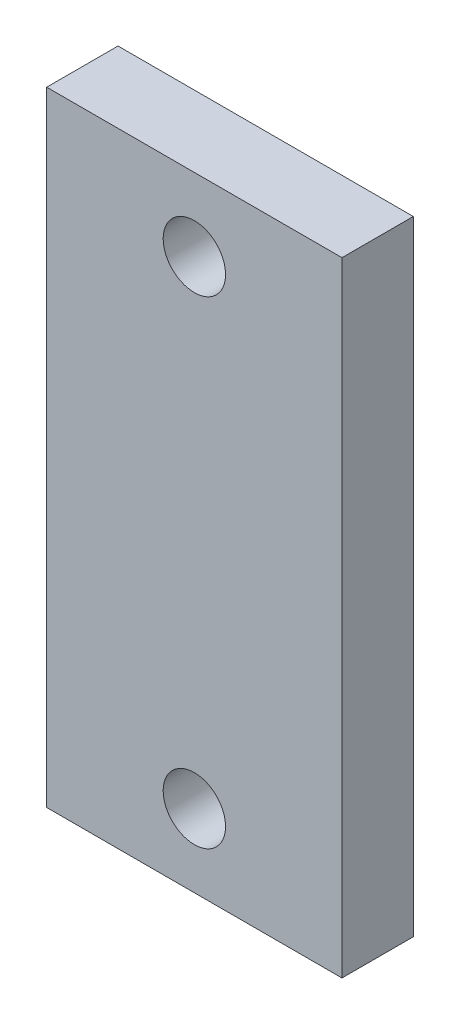
ISO-10303-21;
HEADER;
FILE_DESCRIPTION(('STEP AP214'),'2;1');
FILE_NAME('part.step','',(''),(''),'','','');
FILE_SCHEMA(('AUTOMOTIVE_DESIGN { 1 0 10303 214 1 1 1 1 }'));
ENDSEC;
DATA;
#1=APPLICATION_CONTEXT('core data for automotive mechanical design processes');
#2=APPLICATION_PROTOCOL_DEFINITION('international standard','automotive_design',2000,#1);
#3=PRODUCT_CONTEXT('',#1,'mechanical');
#4=PRODUCT('Part','Part','',(#3));
#5=PRODUCT_RELATED_PRODUCT_CATEGORY('part','',(#4));
#6=PRODUCT_DEFINITION_FORMATION('','',#4);
#7=PRODUCT_DEFINITION_CONTEXT('part definition',#1,'design');
#8=PRODUCT_DEFINITION('design','',#6,#7);
#9=PRODUCT_DEFINITION_SHAPE('','',#8);
#10=(LENGTH_UNIT() NAMED_UNIT(*) SI_UNIT(.MILLI.,.METRE.));
#11=(NAMED_UNIT(*) PLANE_ANGLE_UNIT() SI_UNIT($,.RADIAN.));
#12=(NAMED_UNIT(*) SI_UNIT($,.STERADIAN.) SOLID_ANGLE_UNIT());
#13=UNCERTAINTY_MEASURE_WITH_UNIT(LENGTH_MEASURE(1.E-05),#10,'distance_accuracy_value','');
#14=(GEOMETRIC_REPRESENTATION_CONTEXT(3) GLOBAL_UNCERTAINTY_ASSIGNED_CONTEXT((#13)) GLOBAL_UNIT_ASSIGNED_CONTEXT((#10,
#11,#12)) REPRESENTATION_CONTEXT('',''));
#15=CARTESIAN_POINT('',(0.,0.,0.));
#16=DIRECTION('',(0.,0.,1.));
#17=DIRECTION('',(1.,0.,0.));
#18=AXIS2_PLACEMENT_3D('',#15,#16,#17);
#19=CARTESIAN_POINT('',(0.,0.,3.43));
#20=DIRECTION('',(0.,0.,1.));
#21=DIRECTION('',(1.,0.,0.));
#22=AXIS2_PLACEMENT_3D('',#19,#20,#21);
#23=PLANE('',#22);
#24=CARTESIAN_POINT('',(96.833621,-136.643646,3.43));
#25=DIRECTION('',(0.,0.,1.));
#26=DIRECTION('',(1.,0.,0.));
#27=AXIS2_PLACEMENT_3D('',#24,#25,#26);
#28=CIRCLE('',#27,1.5);
#29=CARTESIAN_POINT('',(95.333621,-136.643646,3.43));
#30=VERTEX_POINT('',#29);
#31=EDGE_CURVE('E97',#30,#30,#28,.T.);
#32=ORIENTED_EDGE('',*,*,#31,.F.);
#33=EDGE_LOOP('',(#32));
#34=FACE_BOUND('',#33,.T.);
#35=DIRECTION('',(0.,-1.,0.));
#36=VECTOR('',#35,1.);
#37=CARTESIAN_POINT('',(89.732371,-110.148646,3.43));
#38=LINE('',#37,#36);
#39=CARTESIAN_POINT('',(89.732371,-110.148646,3.43));
#40=VERTEX_POINT('',#39);
#41=CARTESIAN_POINT('',(89.732371,-140.148646,3.43));
#42=VERTEX_POINT('',#41);
#43=EDGE_CURVE('E82',#40,#42,#38,.T.);
#44=ORIENTED_EDGE('',*,*,#43,.T.);
#45=DIRECTION('',(1.,0.,0.));
#46=VECTOR('',#45,1.);
#47=CARTESIAN_POINT('',(89.732371,-140.148646,3.43));
#48=LINE('',#47,#46);
#49=CARTESIAN_POINT('',(103.932371,-140.148646,3.43));
#50=VERTEX_POINT('',#49);
#51=EDGE_CURVE('E77',#42,#50,#48,.T.);
#52=ORIENTED_EDGE('',*,*,#51,.T.);
#53=DIRECTION('',(0.,1.,0.));
#54=VECTOR('',#53,1.);
#55=CARTESIAN_POINT('',(103.932371,-110.148646,3.43));
#56=LINE('',#55,#54);
#57=CARTESIAN_POINT('',(103.932371,-110.148646,3.43));
#58=VERTEX_POINT('',#57);
#59=EDGE_CURVE('E80',#50,#58,#56,.T.);
#60=ORIENTED_EDGE('',*,*,#59,.T.);
#61=DIRECTION('',(-1.,0.,0.));
#62=VECTOR('',#61,1.);
#63=CARTESIAN_POINT('',(89.732371,-110.148646,3.43));
#64=LINE('',#63,#62);
#65=EDGE_CURVE('E47',#58,#40,#64,.T.);
#66=ORIENTED_EDGE('',*,*,#65,.T.);
#67=EDGE_LOOP('',(#44,#52,#60,#66));
#68=FACE_BOUND('',#67,.T.);
#69=CARTESIAN_POINT('',(96.833621,-113.653646,3.43));
#70=DIRECTION('',(0.,0.,1.));
#71=DIRECTION('',(1.,0.,0.));
#72=AXIS2_PLACEMENT_3D('',#69,#70,#71);
#73=CIRCLE('',#72,1.5);
#74=CARTESIAN_POINT('',(95.333621,-113.653646,3.43));
#75=VERTEX_POINT('',#74);
#76=EDGE_CURVE('E112',#75,#75,#73,.T.);
#77=ORIENTED_EDGE('',*,*,#76,.F.);
#78=EDGE_LOOP('',(#77));
#79=FACE_BOUND('',#78,.T.);
#80=ADVANCED_FACE('F30',(#34,#68,#79),#23,.T.);
#81=CARTESIAN_POINT('',(0.,0.,0.));
#82=DIRECTION('',(0.,0.,1.));
#83=DIRECTION('',(1.,0.,0.));
#84=AXIS2_PLACEMENT_3D('',#81,#82,#83);
#85=PLANE('',#84);
#86=DIRECTION('',(0.,-1.,0.));
#87=VECTOR('',#86,1.);
#88=CARTESIAN_POINT('',(89.732371,-110.148646,0.));
#89=LINE('',#88,#87);
#90=CARTESIAN_POINT('',(89.732371,-110.148646,0.));
#91=VERTEX_POINT('',#90);
#92=CARTESIAN_POINT('',(89.732371,-140.148646,0.));
#93=VERTEX_POINT('',#92);
#94=EDGE_CURVE('E94',#91,#93,#89,.T.);
#95=ORIENTED_EDGE('',*,*,#94,.F.);
#96=DIRECTION('',(-1.,0.,0.));
#97=VECTOR('',#96,1.);
#98=CARTESIAN_POINT('',(89.732371,-110.148646,0.));
#99=LINE('',#98,#97);
#100=CARTESIAN_POINT('',(103.932371,-110.148646,0.));
#101=VERTEX_POINT('',#100);
#102=EDGE_CURVE('E70',#101,#91,#99,.T.);
#103=ORIENTED_EDGE('',*,*,#102,.F.);
#104=DIRECTION('',(0.,1.,0.));
#105=VECTOR('',#104,1.);
#106=CARTESIAN_POINT('',(103.932371,-110.148646,0.));
#107=LINE('',#106,#105);
#108=CARTESIAN_POINT('',(103.932371,-140.148646,0.));
#109=VERTEX_POINT('',#108);
#110=EDGE_CURVE('E64',#109,#101,#107,.T.);
#111=ORIENTED_EDGE('',*,*,#110,.F.);
#112=DIRECTION('',(1.,0.,0.));
#113=VECTOR('',#112,1.);
#114=CARTESIAN_POINT('',(89.732371,-140.148646,0.));
#115=LINE('',#114,#113);
#116=EDGE_CURVE('E86',#93,#109,#115,.T.);
#117=ORIENTED_EDGE('',*,*,#116,.F.);
#118=EDGE_LOOP('',(#95,#103,#111,#117));
#119=FACE_BOUND('',#118,.T.);
#120=CARTESIAN_POINT('',(96.833621,-136.643646,0.));
#121=DIRECTION('',(0.,0.,1.));
#122=DIRECTION('',(1.,0.,0.));
#123=AXIS2_PLACEMENT_3D('',#120,#121,#122);
#124=CIRCLE('',#123,1.5);
#125=CARTESIAN_POINT('',(95.333621,-136.643646,0.));
#126=VERTEX_POINT('',#125);
#127=EDGE_CURVE('E109',#126,#126,#124,.T.);
#128=ORIENTED_EDGE('',*,*,#127,.T.);
#129=EDGE_LOOP('',(#128));
#130=FACE_BOUND('',#129,.T.);
#131=CARTESIAN_POINT('',(96.833621,-113.653646,0.));
#132=DIRECTION('',(0.,0.,1.));
#133=DIRECTION('',(1.,0.,0.));
#134=AXIS2_PLACEMENT_3D('',#131,#132,#133);
#135=CIRCLE('',#134,1.5);
#136=CARTESIAN_POINT('',(95.333621,-113.653646,0.));
#137=VERTEX_POINT('',#136);
#138=EDGE_CURVE('E115',#137,#137,#135,.T.);
#139=ORIENTED_EDGE('',*,*,#138,.T.);
#140=EDGE_LOOP('',(#139));
#141=FACE_BOUND('',#140,.T.);
#142=ADVANCED_FACE('F105',(#119,#130,#141),#85,.F.);
#143=CARTESIAN_POINT('',(89.732371,-110.148646,3.43));
#144=DIRECTION('',(1.,0.,0.));
#145=DIRECTION('',(0.,0.,-1.));
#146=AXIS2_PLACEMENT_3D('',#143,#144,#145);
#147=PLANE('',#146);
#148=ORIENTED_EDGE('',*,*,#94,.T.);
#149=DIRECTION('',(0.,0.,-1.));
#150=VECTOR('',#149,1.);
#151=CARTESIAN_POINT('',(89.732371,-140.148646,3.43));
#152=LINE('',#151,#150);
#153=EDGE_CURVE('E11',#42,#93,#152,.T.);
#154=ORIENTED_EDGE('',*,*,#153,.F.);
#155=ORIENTED_EDGE('',*,*,#43,.F.);
#156=DIRECTION('',(0.,0.,-1.));
#157=VECTOR('',#156,1.);
#158=CARTESIAN_POINT('',(89.732371,-110.148646,3.43));
#159=LINE('',#158,#157);
#160=EDGE_CURVE('E90',#40,#91,#159,.T.);
#161=ORIENTED_EDGE('',*,*,#160,.T.);
#162=EDGE_LOOP('',(#148,#154,#155,#161));
#163=FACE_BOUND('',#162,.T.);
#164=ADVANCED_FACE('F32',(#163),#147,.F.);
#165=CARTESIAN_POINT('',(89.732371,-140.148646,3.43));
#166=DIRECTION('',(0.,1.,0.));
#167=DIRECTION('',(0.,0.,1.));
#168=AXIS2_PLACEMENT_3D('',#165,#166,#167);
#169=PLANE('',#168);
#170=ORIENTED_EDGE('',*,*,#116,.T.);
#171=DIRECTION('',(0.,0.,-1.));
#172=VECTOR('',#171,1.);
#173=CARTESIAN_POINT('',(103.932371,-140.148646,3.43));
#174=LINE('',#173,#172);
#175=EDGE_CURVE('E39',#50,#109,#174,.T.);
#176=ORIENTED_EDGE('',*,*,#175,.F.);
#177=ORIENTED_EDGE('',*,*,#51,.F.);
#178=ORIENTED_EDGE('',*,*,#153,.T.);
#179=EDGE_LOOP('',(#170,#176,#177,#178));
#180=FACE_BOUND('',#179,.T.);
#181=ADVANCED_FACE('F85',(#180),#169,.F.);
#182=CARTESIAN_POINT('',(103.932371,-110.148646,3.43));
#183=DIRECTION('',(-1.,0.,0.));
#184=DIRECTION('',(0.,0.,1.));
#185=AXIS2_PLACEMENT_3D('',#182,#183,#184);
#186=PLANE('',#185);
#187=ORIENTED_EDGE('',*,*,#110,.T.);
#188=DIRECTION('',(0.,0.,-1.));
#189=VECTOR('',#188,1.);
#190=CARTESIAN_POINT('',(103.932371,-110.148646,3.43));
#191=LINE('',#190,#189);
#192=EDGE_CURVE('E87',#58,#101,#191,.T.);
#193=ORIENTED_EDGE('',*,*,#192,.F.);
#194=ORIENTED_EDGE('',*,*,#59,.F.);
#195=ORIENTED_EDGE('',*,*,#175,.T.);
#196=EDGE_LOOP('',(#187,#193,#194,#195));
#197=FACE_BOUND('',#196,.T.);
#198=ADVANCED_FACE('F88',(#197),#186,.F.);
#199=CARTESIAN_POINT('',(89.732371,-110.148646,3.43));
#200=DIRECTION('',(0.,-1.,0.));
#201=DIRECTION('',(0.,0.,-1.));
#202=AXIS2_PLACEMENT_3D('',#199,#200,#201);
#203=PLANE('',#202);
#204=ORIENTED_EDGE('',*,*,#102,.T.);
#205=ORIENTED_EDGE('',*,*,#160,.F.);
#206=ORIENTED_EDGE('',*,*,#65,.F.);
#207=ORIENTED_EDGE('',*,*,#192,.T.);
#208=EDGE_LOOP('',(#204,#205,#206,#207));
#209=FACE_BOUND('',#208,.T.);
#210=ADVANCED_FACE('F102',(#209),#203,.F.);
#211=CARTESIAN_POINT('',(96.833621,-136.643646,3.43));
#212=DIRECTION('',(0.,0.,-1.));
#213=DIRECTION('',(-1.,0.,0.));
#214=AXIS2_PLACEMENT_3D('',#211,#212,#213);
#215=CYLINDRICAL_SURFACE('',#214,1.5);
#216=CARTESIAN_POINT('',(95.333621,-136.643646,3.43));
#217=CARTESIAN_POINT('',(95.333621,-136.643646,3.39427083333333));
#218=CARTESIAN_POINT('',(95.333621,-136.643646,3.35854166666667));
#219=CARTESIAN_POINT('',(95.333621,-136.643646,3.28708333333333));
#220=CARTESIAN_POINT('',(95.333621,-136.643646,3.25135416666667));
#221=CARTESIAN_POINT('',(95.333621,-136.643646,3.17989583333333));
#222=CARTESIAN_POINT('',(95.333621,-136.643646,3.14416666666667));
#223=CARTESIAN_POINT('',(95.333621,-136.643646,3.07270833333333));
#224=CARTESIAN_POINT('',(95.333621,-136.643646,3.03697916666667));
#225=CARTESIAN_POINT('',(95.333621,-136.643646,2.96552083333333));
#226=CARTESIAN_POINT('',(95.333621,-136.643646,2.92979166666667));
#227=CARTESIAN_POINT('',(95.333621,-136.643646,2.85833333333333));
#228=CARTESIAN_POINT('',(95.333621,-136.643646,2.82260416666667));
#229=CARTESIAN_POINT('',(95.333621,-136.643646,2.75114583333333));
#230=CARTESIAN_POINT('',(95.333621,-136.643646,2.71541666666667));
#231=CARTESIAN_POINT('',(95.333621,-136.643646,2.64395833333333));
#232=CARTESIAN_POINT('',(95.333621,-136.643646,2.60822916666667));
#233=CARTESIAN_POINT('',(95.333621,-136.643646,2.53677083333333));
#234=CARTESIAN_POINT('',(95.333621,-136.643646,2.50104166666667));
#235=CARTESIAN_POINT('',(95.333621,-136.643646,2.42958333333333));
#236=CARTESIAN_POINT('',(95.333621,-136.643646,2.39385416666667));
#237=CARTESIAN_POINT('',(95.333621,-136.643646,2.32239583333333));
#238=CARTESIAN_POINT('',(95.333621,-136.643646,2.28666666666667));
#239=CARTESIAN_POINT('',(95.333621,-136.643646,2.21520833333333));
#240=CARTESIAN_POINT('',(95.333621,-136.643646,2.17947916666667));
#241=CARTESIAN_POINT('',(95.333621,-136.643646,2.10802083333333));
#242=CARTESIAN_POINT('',(95.333621,-136.643646,2.07229166666667));
#243=CARTESIAN_POINT('',(95.333621,-136.643646,2.00083333333333));
#244=CARTESIAN_POINT('',(95.333621,-136.643646,1.96510416666667));
#245=CARTESIAN_POINT('',(95.333621,-136.643646,1.89364583333333));
#246=CARTESIAN_POINT('',(95.333621,-136.643646,1.85791666666667));
#247=CARTESIAN_POINT('',(95.333621,-136.643646,1.78645833333333));
#248=CARTESIAN_POINT('',(95.333621,-136.643646,1.75072916666667));
#249=CARTESIAN_POINT('',(95.333621,-136.643646,1.67927083333333));
#250=CARTESIAN_POINT('',(95.333621,-136.643646,1.64354166666667));
#251=CARTESIAN_POINT('',(95.333621,-136.643646,1.57208333333333));
#252=CARTESIAN_POINT('',(95.333621,-136.643646,1.53635416666667));
#253=CARTESIAN_POINT('',(95.333621,-136.643646,1.46489583333333));
#254=CARTESIAN_POINT('',(95.333621,-136.643646,1.42916666666667));
#255=CARTESIAN_POINT('',(95.333621,-136.643646,1.35770833333333));
#256=CARTESIAN_POINT('',(95.333621,-136.643646,1.32197916666667));
#257=CARTESIAN_POINT('',(95.333621,-136.643646,1.25052083333333));
#258=CARTESIAN_POINT('',(95.333621,-136.643646,1.21479166666667));
#259=CARTESIAN_POINT('',(95.333621,-136.643646,1.14333333333333));
#260=CARTESIAN_POINT('',(95.333621,-136.643646,1.10760416666667));
#261=CARTESIAN_POINT('',(95.333621,-136.643646,1.03614583333333));
#262=CARTESIAN_POINT('',(95.333621,-136.643646,1.00041666666667));
#263=CARTESIAN_POINT('',(95.333621,-136.643646,0.928958333333334));
#264=CARTESIAN_POINT('',(95.333621,-136.643646,0.893229166666667));
#265=CARTESIAN_POINT('',(95.333621,-136.643646,0.821770833333334));
#266=CARTESIAN_POINT('',(95.333621,-136.643646,0.786041666666667));
#267=CARTESIAN_POINT('',(95.333621,-136.643646,0.714583333333333));
#268=CARTESIAN_POINT('',(95.333621,-136.643646,0.678854166666667));
#269=CARTESIAN_POINT('',(95.333621,-136.643646,0.607395833333333));
#270=CARTESIAN_POINT('',(95.333621,-136.643646,0.571666666666667));
#271=CARTESIAN_POINT('',(95.333621,-136.643646,0.500208333333333));
#272=CARTESIAN_POINT('',(95.333621,-136.643646,0.464479166666667));
#273=CARTESIAN_POINT('',(95.333621,-136.643646,0.393020833333334));
#274=CARTESIAN_POINT('',(95.333621,-136.643646,0.357291666666667));
#275=CARTESIAN_POINT('',(95.333621,-136.643646,0.285833333333334));
#276=CARTESIAN_POINT('',(95.333621,-136.643646,0.250104166666667));
#277=CARTESIAN_POINT('',(95.333621,-136.643646,0.178645833333333));
#278=CARTESIAN_POINT('',(95.333621,-136.643646,0.142916666666667));
#279=CARTESIAN_POINT('',(95.333621,-136.643646,0.0714583333333334));
#280=CARTESIAN_POINT('',(95.333621,-136.643646,0.0357291666666667));
#281=CARTESIAN_POINT('',(95.333621,-136.643646,0.));
#282=B_SPLINE_CURVE_WITH_KNOTS('',3,(#216,#217,#218,#219,#220,#221,#222,#223,#224,#225,#226,
#227,#228,#229,#230,#231,#232,#233,#234,#235,#236,#237,#238,#239,#240,#241,#242,#243,#244,#245,
#246,#247,#248,#249,#250,#251,#252,#253,#254,#255,#256,#257,#258,#259,#260,#261,#262,#263,#264,
#265,#266,#267,#268,#269,#270,#271,#272,#273,#274,#275,#276,#277,#278,#279,#280,#281),
.UNSPECIFIED.,.F.,.F.,(4,2,2,2,2,2,2,2,2,2,2,2,2,2,2,2,2,2,2,2,2,2,2,2,2,2,2,2,2,2,2,2,4),(0.,
0.1071875,0.214375,0.3215625,0.42875,0.5359375,0.643125,0.7503125,0.8575,0.9646875,1.071875,
1.1790625,1.28625,1.3934375,1.500625,1.6078125,1.715,1.8221875,1.929375,2.0365625,2.14375,
2.2509375,2.358125,2.4653125,2.5725,2.6796875,2.786875,2.8940625,3.00125,3.1084375,3.215625,
3.3228125,3.43),.UNSPECIFIED.);
#283=EDGE_CURVE('BSEAM132',#30,#126,#282,.T.);
#284=ORIENTED_EDGE('',*,*,#31,.T.);
#285=ORIENTED_EDGE('',*,*,#127,.F.);
#286=ORIENTED_EDGE('',*,*,#283,.T.);
#287=ORIENTED_EDGE('',*,*,#283,.F.);
#288=EDGE_LOOP('',(#284,#286,#285,#287));
#289=FACE_BOUND('',#288,.T.);
#290=ADVANCED_FACE('F132',(#289),#215,.F.);
#291=CARTESIAN_POINT('',(96.833621,-113.653646,3.43));
#292=DIRECTION('',(0.,0.,-1.));
#293=DIRECTION('',(-1.,0.,0.));
#294=AXIS2_PLACEMENT_3D('',#291,#292,#293);
#295=CYLINDRICAL_SURFACE('',#294,1.5);
#296=CARTESIAN_POINT('',(95.333621,-113.653646,3.43));
#297=CARTESIAN_POINT('',(95.333621,-113.653646,3.39427083333333));
#298=CARTESIAN_POINT('',(95.333621,-113.653646,3.35854166666667));
#299=CARTESIAN_POINT('',(95.333621,-113.653646,3.28708333333333));
#300=CARTESIAN_POINT('',(95.333621,-113.653646,3.25135416666667));
#301=CARTESIAN_POINT('',(95.333621,-113.653646,3.17989583333333));
#302=CARTESIAN_POINT('',(95.333621,-113.653646,3.14416666666667));
#303=CARTESIAN_POINT('',(95.333621,-113.653646,3.07270833333333));
#304=CARTESIAN_POINT('',(95.333621,-113.653646,3.03697916666667));
#305=CARTESIAN_POINT('',(95.333621,-113.653646,2.96552083333333));
#306=CARTESIAN_POINT('',(95.333621,-113.653646,2.92979166666667));
#307=CARTESIAN_POINT('',(95.333621,-113.653646,2.85833333333333));
#308=CARTESIAN_POINT('',(95.333621,-113.653646,2.82260416666667));
#309=CARTESIAN_POINT('',(95.333621,-113.653646,2.75114583333333));
#310=CARTESIAN_POINT('',(95.333621,-113.653646,2.71541666666667));
#311=CARTESIAN_POINT('',(95.333621,-113.653646,2.64395833333333));
#312=CARTESIAN_POINT('',(95.333621,-113.653646,2.60822916666667));
#313=CARTESIAN_POINT('',(95.333621,-113.653646,2.53677083333333));
#314=CARTESIAN_POINT('',(95.333621,-113.653646,2.50104166666667));
#315=CARTESIAN_POINT('',(95.333621,-113.653646,2.42958333333333));
#316=CARTESIAN_POINT('',(95.333621,-113.653646,2.39385416666667));
#317=CARTESIAN_POINT('',(95.333621,-113.653646,2.32239583333333));
#318=CARTESIAN_POINT('',(95.333621,-113.653646,2.28666666666667));
#319=CARTESIAN_POINT('',(95.333621,-113.653646,2.21520833333333));
#320=CARTESIAN_POINT('',(95.333621,-113.653646,2.17947916666667));
#321=CARTESIAN_POINT('',(95.333621,-113.653646,2.10802083333333));
#322=CARTESIAN_POINT('',(95.333621,-113.653646,2.07229166666667));
#323=CARTESIAN_POINT('',(95.333621,-113.653646,2.00083333333333));
#324=CARTESIAN_POINT('',(95.333621,-113.653646,1.96510416666667));
#325=CARTESIAN_POINT('',(95.333621,-113.653646,1.89364583333333));
#326=CARTESIAN_POINT('',(95.333621,-113.653646,1.85791666666667));
#327=CARTESIAN_POINT('',(95.333621,-113.653646,1.78645833333333));
#328=CARTESIAN_POINT('',(95.333621,-113.653646,1.75072916666667));
#329=CARTESIAN_POINT('',(95.333621,-113.653646,1.67927083333333));
#330=CARTESIAN_POINT('',(95.333621,-113.653646,1.64354166666667));
#331=CARTESIAN_POINT('',(95.333621,-113.653646,1.57208333333333));
#332=CARTESIAN_POINT('',(95.333621,-113.653646,1.53635416666667));
#333=CARTESIAN_POINT('',(95.333621,-113.653646,1.46489583333333));
#334=CARTESIAN_POINT('',(95.333621,-113.653646,1.42916666666667));
#335=CARTESIAN_POINT('',(95.333621,-113.653646,1.35770833333333));
#336=CARTESIAN_POINT('',(95.333621,-113.653646,1.32197916666667));
#337=CARTESIAN_POINT('',(95.333621,-113.653646,1.25052083333333));
#338=CARTESIAN_POINT('',(95.333621,-113.653646,1.21479166666667));
#339=CARTESIAN_POINT('',(95.333621,-113.653646,1.14333333333333));
#340=CARTESIAN_POINT('',(95.333621,-113.653646,1.10760416666667));
#341=CARTESIAN_POINT('',(95.333621,-113.653646,1.03614583333333));
#342=CARTESIAN_POINT('',(95.333621,-113.653646,1.00041666666667));
#343=CARTESIAN_POINT('',(95.333621,-113.653646,0.928958333333334));
#344=CARTESIAN_POINT('',(95.333621,-113.653646,0.893229166666667));
#345=CARTESIAN_POINT('',(95.333621,-113.653646,0.821770833333334));
#346=CARTESIAN_POINT('',(95.333621,-113.653646,0.786041666666667));
#347=CARTESIAN_POINT('',(95.333621,-113.653646,0.714583333333333));
#348=CARTESIAN_POINT('',(95.333621,-113.653646,0.678854166666667));
#349=CARTESIAN_POINT('',(95.333621,-113.653646,0.607395833333333));
#350=CARTESIAN_POINT('',(95.333621,-113.653646,0.571666666666667));
#351=CARTESIAN_POINT('',(95.333621,-113.653646,0.500208333333333));
#352=CARTESIAN_POINT('',(95.333621,-113.653646,0.464479166666667));
#353=CARTESIAN_POINT('',(95.333621,-113.653646,0.393020833333334));
#354=CARTESIAN_POINT('',(95.333621,-113.653646,0.357291666666667));
#355=CARTESIAN_POINT('',(95.333621,-113.653646,0.285833333333334));
#356=CARTESIAN_POINT('',(95.333621,-113.653646,0.250104166666667));
#357=CARTESIAN_POINT('',(95.333621,-113.653646,0.178645833333333));
#358=CARTESIAN_POINT('',(95.333621,-113.653646,0.142916666666667));
#359=CARTESIAN_POINT('',(95.333621,-113.653646,0.0714583333333334));
#360=CARTESIAN_POINT('',(95.333621,-113.653646,0.0357291666666667));
#361=CARTESIAN_POINT('',(95.333621,-113.653646,0.));
#362=B_SPLINE_CURVE_WITH_KNOTS('',3,(#296,#297,#298,#299,#300,#301,#302,#303,#304,#305,#306,
#307,#308,#309,#310,#311,#312,#313,#314,#315,#316,#317,#318,#319,#320,#321,#322,#323,#324,#325,
#326,#327,#328,#329,#330,#331,#332,#333,#334,#335,#336,#337,#338,#339,#340,#341,#342,#343,#344,
#345,#346,#347,#348,#349,#350,#351,#352,#353,#354,#355,#356,#357,#358,#359,#360,#361),
.UNSPECIFIED.,.F.,.F.,(4,2,2,2,2,2,2,2,2,2,2,2,2,2,2,2,2,2,2,2,2,2,2,2,2,2,2,2,2,2,2,2,4),(0.,
0.1071875,0.214375,0.3215625,0.42875,0.5359375,0.643125,0.7503125,0.8575,0.9646875,1.071875,
1.1790625,1.28625,1.3934375,1.500625,1.6078125,1.715,1.8221875,1.929375,2.0365625,2.14375,
2.2509375,2.358125,2.4653125,2.5725,2.6796875,2.786875,2.8940625,3.00125,3.1084375,3.215625,
3.3228125,3.43),.UNSPECIFIED.);
#363=EDGE_CURVE('BSEAM121',#75,#137,#362,.T.);
#364=ORIENTED_EDGE('',*,*,#76,.T.);
#365=ORIENTED_EDGE('',*,*,#138,.F.);
#366=ORIENTED_EDGE('',*,*,#363,.T.);
#367=ORIENTED_EDGE('',*,*,#363,.F.);
#368=EDGE_LOOP('',(#364,#366,#365,#367));
#369=FACE_BOUND('',#368,.T.);
#370=ADVANCED_FACE('F121',(#369),#295,.F.);
#371=CLOSED_SHELL('',(#80,#142,#164,#181,#198,#210,#290,#370));
#372=MANIFOLD_SOLID_BREP('B2',#371);
#373=ADVANCED_BREP_SHAPE_REPRESENTATION('',(#18,#372),#14);
#374=SHAPE_DEFINITION_REPRESENTATION(#9,#373);
ENDSEC;
END-ISO-10303-21;
